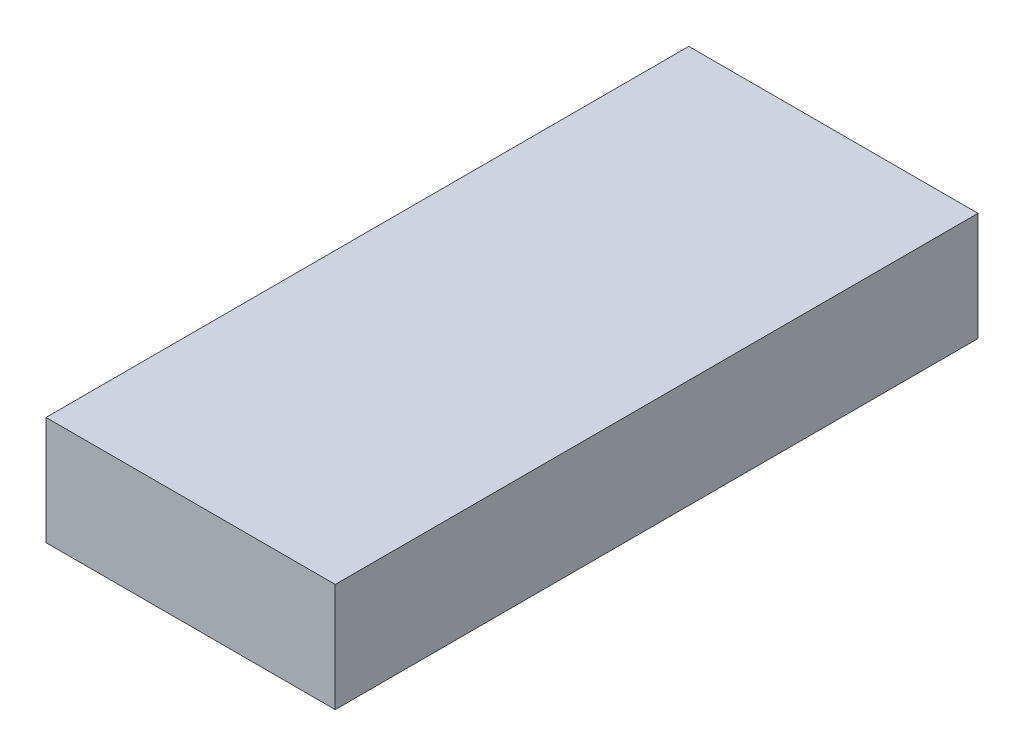
ISO-10303-21;
HEADER;
FILE_DESCRIPTION(('STEP AP214'),'2;1');
FILE_NAME('part.step','',(''),(''),'','','');
FILE_SCHEMA(('AUTOMOTIVE_DESIGN { 1 0 10303 214 1 1 1 1 }'));
ENDSEC;
DATA;
#1=APPLICATION_CONTEXT('core data for automotive mechanical design processes');
#2=APPLICATION_PROTOCOL_DEFINITION('international standard','automotive_design',2000,#1);
#3=PRODUCT_CONTEXT('',#1,'mechanical');
#4=PRODUCT('Part','Part','',(#3));
#5=PRODUCT_RELATED_PRODUCT_CATEGORY('part','',(#4));
#6=PRODUCT_DEFINITION_FORMATION('','',#4);
#7=PRODUCT_DEFINITION_CONTEXT('part definition',#1,'design');
#8=PRODUCT_DEFINITION('design','',#6,#7);
#9=PRODUCT_DEFINITION_SHAPE('','',#8);
#10=(LENGTH_UNIT() NAMED_UNIT(*) SI_UNIT(.MILLI.,.METRE.));
#11=(NAMED_UNIT(*) PLANE_ANGLE_UNIT() SI_UNIT($,.RADIAN.));
#12=(NAMED_UNIT(*) SI_UNIT($,.STERADIAN.) SOLID_ANGLE_UNIT());
#13=UNCERTAINTY_MEASURE_WITH_UNIT(LENGTH_MEASURE(1.E-05),#10,'distance_accuracy_value','');
#14=(GEOMETRIC_REPRESENTATION_CONTEXT(3) GLOBAL_UNCERTAINTY_ASSIGNED_CONTEXT((#13)) GLOBAL_UNIT_ASSIGNED_CONTEXT((#10,
#11,#12)) REPRESENTATION_CONTEXT('',''));
#15=CARTESIAN_POINT('',(0.,0.,0.));
#16=DIRECTION('',(0.,0.,1.));
#17=DIRECTION('',(1.,0.,0.));
#18=AXIS2_PLACEMENT_3D('',#15,#16,#17);
#19=CARTESIAN_POINT('',(0.35999928,0.135001,1.59999934));
#20=DIRECTION('',(0.,0.,-1.));
#21=DIRECTION('',(0.,-1.,0.));
#22=AXIS2_PLACEMENT_3D('',#19,#20,#21);
#23=PLANE('',#22);
#24=DIRECTION('',(-1.,0.,0.));
#25=VECTOR('',#24,1.);
#26=CARTESIAN_POINT('',(0.35999928,0.135001,1.59999934));
#27=LINE('',#26,#25);
#28=CARTESIAN_POINT('',(0.35999928,0.135001,1.59999934));
#29=VERTEX_POINT('',#28);
#30=CARTESIAN_POINT('',(-0.35999928,0.135001,1.59999934));
#31=VERTEX_POINT('',#30);
#32=EDGE_CURVE('E90',#29,#31,#27,.T.);
#33=ORIENTED_EDGE('',*,*,#32,.T.);
#34=DIRECTION('',(0.,-1.,0.));
#35=VECTOR('',#34,1.);
#36=CARTESIAN_POINT('',(-0.35999928,0.135001,1.59999934));
#37=LINE('',#36,#35);
#38=CARTESIAN_POINT('',(-0.35999928,-0.135001,1.59999934));
#39=VERTEX_POINT('',#38);
#40=EDGE_CURVE('E85',#31,#39,#37,.T.);
#41=ORIENTED_EDGE('',*,*,#40,.T.);
#42=DIRECTION('',(1.,0.,0.));
#43=VECTOR('',#42,1.);
#44=CARTESIAN_POINT('',(-0.35999928,-0.135001,1.59999934));
#45=LINE('',#44,#43);
#46=CARTESIAN_POINT('',(0.35999928,-0.135001,1.59999934));
#47=VERTEX_POINT('',#46);
#48=EDGE_CURVE('E101',#39,#47,#45,.T.);
#49=ORIENTED_EDGE('',*,*,#48,.T.);
#50=DIRECTION('',(0.,1.,0.));
#51=VECTOR('',#50,1.);
#52=CARTESIAN_POINT('',(0.35999928,-0.135001,1.59999934));
#53=LINE('',#52,#51);
#54=EDGE_CURVE('E11',#47,#29,#53,.T.);
#55=ORIENTED_EDGE('',*,*,#54,.T.);
#56=EDGE_LOOP('',(#33,#41,#49,#55));
#57=FACE_BOUND('',#56,.T.);
#58=ADVANCED_FACE('F16',(#57),#23,.F.);
#59=CARTESIAN_POINT('',(0.35999928,0.135001,0.));
#60=DIRECTION('',(0.,0.,-1.));
#61=DIRECTION('',(0.,-1.,0.));
#62=AXIS2_PLACEMENT_3D('',#59,#60,#61);
#63=PLANE('',#62);
#64=DIRECTION('',(0.,1.,0.));
#65=VECTOR('',#64,1.);
#66=CARTESIAN_POINT('',(0.35999928,-0.135001,0.));
#67=LINE('',#66,#65);
#68=CARTESIAN_POINT('',(0.35999928,-0.135001,0.));
#69=VERTEX_POINT('',#68);
#70=CARTESIAN_POINT('',(0.35999928,0.135001,0.));
#71=VERTEX_POINT('',#70);
#72=EDGE_CURVE('E20',#69,#71,#67,.T.);
#73=ORIENTED_EDGE('',*,*,#72,.F.);
#74=DIRECTION('',(1.,0.,0.));
#75=VECTOR('',#74,1.);
#76=CARTESIAN_POINT('',(-0.35999928,-0.135001,0.));
#77=LINE('',#76,#75);
#78=CARTESIAN_POINT('',(-0.35999928,-0.135001,0.));
#79=VERTEX_POINT('',#78);
#80=EDGE_CURVE('E73',#79,#69,#77,.T.);
#81=ORIENTED_EDGE('',*,*,#80,.F.);
#82=DIRECTION('',(0.,-1.,0.));
#83=VECTOR('',#82,1.);
#84=CARTESIAN_POINT('',(-0.35999928,0.135001,0.));
#85=LINE('',#84,#83);
#86=CARTESIAN_POINT('',(-0.35999928,0.135001,0.));
#87=VERTEX_POINT('',#86);
#88=EDGE_CURVE('E68',#87,#79,#85,.T.);
#89=ORIENTED_EDGE('',*,*,#88,.F.);
#90=DIRECTION('',(-1.,0.,0.));
#91=VECTOR('',#90,1.);
#92=CARTESIAN_POINT('',(0.35999928,0.135001,0.));
#93=LINE('',#92,#91);
#94=EDGE_CURVE('E71',#71,#87,#93,.T.);
#95=ORIENTED_EDGE('',*,*,#94,.F.);
#96=EDGE_LOOP('',(#73,#81,#89,#95));
#97=FACE_BOUND('',#96,.T.);
#98=ADVANCED_FACE('F18',(#97),#63,.T.);
#99=CARTESIAN_POINT('',(0.35999928,-0.135001,0.));
#100=DIRECTION('',(-1.,0.,0.));
#101=DIRECTION('',(0.,0.,1.));
#102=AXIS2_PLACEMENT_3D('',#99,#100,#101);
#103=PLANE('',#102);
#104=ORIENTED_EDGE('',*,*,#72,.T.);
#105=DIRECTION('',(0.,0.,1.));
#106=VECTOR('',#105,1.);
#107=CARTESIAN_POINT('',(0.35999928,0.135001,0.));
#108=LINE('',#107,#106);
#109=EDGE_CURVE('E79',#71,#29,#108,.T.);
#110=ORIENTED_EDGE('',*,*,#109,.T.);
#111=ORIENTED_EDGE('',*,*,#54,.F.);
#112=DIRECTION('',(0.,0.,1.));
#113=VECTOR('',#112,1.);
#114=CARTESIAN_POINT('',(0.35999928,-0.135001,0.));
#115=LINE('',#114,#113);
#116=EDGE_CURVE('E103',#69,#47,#115,.T.);
#117=ORIENTED_EDGE('',*,*,#116,.F.);
#118=EDGE_LOOP('',(#104,#110,#111,#117));
#119=FACE_BOUND('',#118,.T.);
#120=ADVANCED_FACE('F123',(#119),#103,.F.);
#121=CARTESIAN_POINT('',(-0.35999928,-0.135001,0.));
#122=DIRECTION('',(0.,1.,0.));
#123=DIRECTION('',(1.,0.,0.));
#124=AXIS2_PLACEMENT_3D('',#121,#122,#123);
#125=PLANE('',#124);
#126=ORIENTED_EDGE('',*,*,#80,.T.);
#127=ORIENTED_EDGE('',*,*,#116,.T.);
#128=ORIENTED_EDGE('',*,*,#48,.F.);
#129=DIRECTION('',(0.,0.,1.));
#130=VECTOR('',#129,1.);
#131=CARTESIAN_POINT('',(-0.35999928,-0.135001,0.));
#132=LINE('',#131,#130);
#133=EDGE_CURVE('E78',#79,#39,#132,.T.);
#134=ORIENTED_EDGE('',*,*,#133,.F.);
#135=EDGE_LOOP('',(#126,#127,#128,#134));
#136=FACE_BOUND('',#135,.T.);
#137=ADVANCED_FACE('F124',(#136),#125,.F.);
#138=CARTESIAN_POINT('',(-0.35999928,0.135001,0.));
#139=DIRECTION('',(1.,0.,0.));
#140=DIRECTION('',(0.,1.,0.));
#141=AXIS2_PLACEMENT_3D('',#138,#139,#140);
#142=PLANE('',#141);
#143=ORIENTED_EDGE('',*,*,#88,.T.);
#144=ORIENTED_EDGE('',*,*,#133,.T.);
#145=ORIENTED_EDGE('',*,*,#40,.F.);
#146=DIRECTION('',(0.,0.,1.));
#147=VECTOR('',#146,1.);
#148=CARTESIAN_POINT('',(-0.35999928,0.135001,0.));
#149=LINE('',#148,#147);
#150=EDGE_CURVE('E82',#87,#31,#149,.T.);
#151=ORIENTED_EDGE('',*,*,#150,.F.);
#152=EDGE_LOOP('',(#143,#144,#145,#151));
#153=FACE_BOUND('',#152,.T.);
#154=ADVANCED_FACE('F83',(#153),#142,.F.);
#155=CARTESIAN_POINT('',(0.35999928,0.135001,0.));
#156=DIRECTION('',(0.,-1.,0.));
#157=DIRECTION('',(0.,0.,-1.));
#158=AXIS2_PLACEMENT_3D('',#155,#156,#157);
#159=PLANE('',#158);
#160=ORIENTED_EDGE('',*,*,#94,.T.);
#161=ORIENTED_EDGE('',*,*,#150,.T.);
#162=ORIENTED_EDGE('',*,*,#32,.F.);
#163=ORIENTED_EDGE('',*,*,#109,.F.);
#164=EDGE_LOOP('',(#160,#161,#162,#163));
#165=FACE_BOUND('',#164,.T.);
#166=ADVANCED_FACE('F92',(#165),#159,.F.);
#167=CLOSED_SHELL('',(#58,#98,#120,#137,#154,#166));
#168=MANIFOLD_SOLID_BREP('B1',#167);
#169=ADVANCED_BREP_SHAPE_REPRESENTATION('',(#18,#168),#14);
#170=SHAPE_DEFINITION_REPRESENTATION(#9,#169);
ENDSEC;
END-ISO-10303-21;
